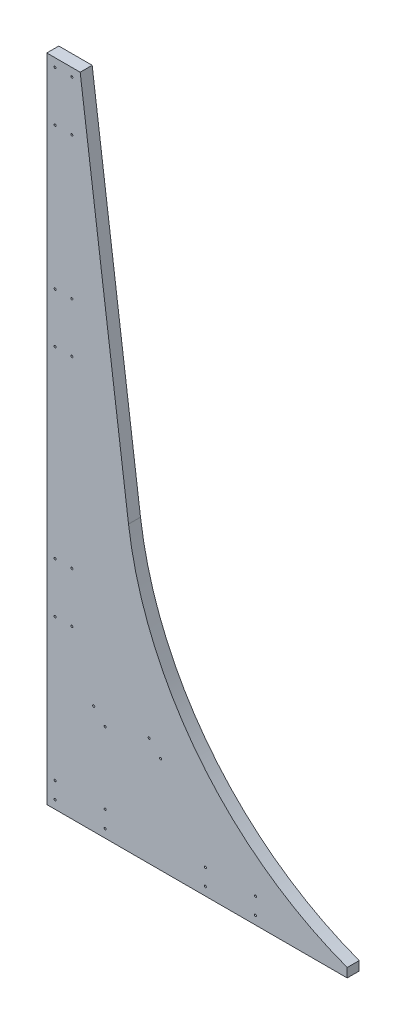
ISO-10303-21;
HEADER;
FILE_DESCRIPTION(('STEP AP214'),'2;1');
FILE_NAME('part.step','',(''),(''),'','','');
FILE_SCHEMA(('AUTOMOTIVE_DESIGN { 1 0 10303 214 1 1 1 1 }'));
ENDSEC;
DATA;
#1=APPLICATION_CONTEXT('core data for automotive mechanical design processes');
#2=APPLICATION_PROTOCOL_DEFINITION('international standard','automotive_design',2000,#1);
#3=PRODUCT_CONTEXT('',#1,'mechanical');
#4=PRODUCT('Part','Part','',(#3));
#5=PRODUCT_RELATED_PRODUCT_CATEGORY('part','',(#4));
#6=PRODUCT_DEFINITION_FORMATION('','',#4);
#7=PRODUCT_DEFINITION_CONTEXT('part definition',#1,'design');
#8=PRODUCT_DEFINITION('design','',#6,#7);
#9=PRODUCT_DEFINITION_SHAPE('','',#8);
#10=(LENGTH_UNIT() NAMED_UNIT(*) SI_UNIT(.MILLI.,.METRE.));
#11=(NAMED_UNIT(*) PLANE_ANGLE_UNIT() SI_UNIT($,.RADIAN.));
#12=(NAMED_UNIT(*) SI_UNIT($,.STERADIAN.) SOLID_ANGLE_UNIT());
#13=UNCERTAINTY_MEASURE_WITH_UNIT(LENGTH_MEASURE(1.E-05),#10,'distance_accuracy_value','');
#14=(GEOMETRIC_REPRESENTATION_CONTEXT(3) GLOBAL_UNCERTAINTY_ASSIGNED_CONTEXT((#13)) GLOBAL_UNIT_ASSIGNED_CONTEXT((#10,
#11,#12)) REPRESENTATION_CONTEXT('',''));
#15=CARTESIAN_POINT('',(0.,0.,0.));
#16=DIRECTION('',(0.,0.,1.));
#17=DIRECTION('',(1.,0.,0.));
#18=AXIS2_PLACEMENT_3D('',#15,#16,#17);
#19=CARTESIAN_POINT('',(638.116559349375,499.436357901165,18.25625));
#20=DIRECTION('',(0.,0.,-1.));
#21=DIRECTION('',(-1.,0.,0.));
#22=AXIS2_PLACEMENT_3D('',#19,#20,#21);
#23=CYLINDRICAL_SURFACE('',#22,518.182264806593);
#24=CARTESIAN_POINT('',(638.116559349375,499.436357901165,0.));
#25=DIRECTION('',(0.,0.,1.));
#26=DIRECTION('',(1.,0.,0.));
#27=AXIS2_PLACEMENT_3D('',#24,#25,#26);
#28=CIRCLE('',#27,518.182264806593);
#29=CARTESIAN_POINT('',(124.367415651835,431.8,0.));
#30=VERTEX_POINT('',#29);
#31=CARTESIAN_POINT('',(457.201,13.8620382080899,0.));
#32=VERTEX_POINT('',#31);
#33=EDGE_CURVE('E133',#30,#32,#28,.T.);
#34=ORIENTED_EDGE('',*,*,#33,.F.);
#35=DIRECTION('',(0.,0.,-1.));
#36=VECTOR('',#35,1.);
#37=CARTESIAN_POINT('',(124.367415651835,431.8,18.25625));
#38=LINE('',#37,#36);
#39=CARTESIAN_POINT('',(124.367415651835,431.8,18.25625));
#40=VERTEX_POINT('',#39);
#41=EDGE_CURVE('E11',#40,#30,#38,.T.);
#42=ORIENTED_EDGE('',*,*,#41,.F.);
#43=CARTESIAN_POINT('',(638.116559349375,499.436357901165,18.25625));
#44=DIRECTION('',(0.,0.,1.));
#45=DIRECTION('',(1.,0.,0.));
#46=AXIS2_PLACEMENT_3D('',#43,#44,#45);
#47=CIRCLE('',#46,518.182264806593);
#48=CARTESIAN_POINT('',(457.201,13.8620382080899,18.25625));
#49=VERTEX_POINT('',#48);
#50=EDGE_CURVE('E154',#40,#49,#47,.T.);
#51=ORIENTED_EDGE('',*,*,#50,.T.);
#52=DIRECTION('',(0.,0.,-1.));
#53=VECTOR('',#52,1.);
#54=CARTESIAN_POINT('',(457.201,13.8620382080899,18.25625));
#55=LINE('',#54,#53);
#56=EDGE_CURVE('E61',#49,#32,#55,.T.);
#57=ORIENTED_EDGE('',*,*,#56,.T.);
#58=EDGE_LOOP('',(#34,#42,#51,#57));
#59=FACE_BOUND('',#58,.T.);
#60=ADVANCED_FACE('F44',(#59),#23,.F.);
#61=CARTESIAN_POINT('',(178.127589027018,23.4509419846275,18.25625));
#62=DIRECTION('',(0.991444861373811,0.130526192220048,0.));
#63=DIRECTION('',(-0.130526192220048,0.991444861373811,0.));
#64=AXIS2_PLACEMENT_3D('',#61,#62,#63);
#65=PLANE('',#64);
#66=DIRECTION('',(0.130526192220048,-0.991444861373811,0.));
#67=VECTOR('',#66,1.);
#68=CARTESIAN_POINT('',(178.127589027018,23.4509419846275,0.));
#69=LINE('',#68,#67);
#70=CARTESIAN_POINT('',(50.8,990.6,0.));
#71=VERTEX_POINT('',#70);
#72=EDGE_CURVE('E136',#71,#30,#69,.T.);
#73=ORIENTED_EDGE('',*,*,#72,.F.);
#74=DIRECTION('',(0.,0.,-1.));
#75=VECTOR('',#74,1.);
#76=CARTESIAN_POINT('',(50.8,990.6,18.25625));
#77=LINE('',#76,#75);
#78=CARTESIAN_POINT('',(50.8,990.6,18.25625));
#79=VERTEX_POINT('',#78);
#80=EDGE_CURVE('E53',#79,#71,#77,.T.);
#81=ORIENTED_EDGE('',*,*,#80,.F.);
#82=DIRECTION('',(0.130526192220048,-0.991444861373811,0.));
#83=VECTOR('',#82,1.);
#84=CARTESIAN_POINT('',(178.127589027018,23.4509419846275,18.25625));
#85=LINE('',#84,#83);
#86=EDGE_CURVE('E127',#79,#40,#85,.T.);
#87=ORIENTED_EDGE('',*,*,#86,.T.);
#88=ORIENTED_EDGE('',*,*,#41,.T.);
#89=EDGE_LOOP('',(#73,#81,#87,#88));
#90=FACE_BOUND('',#89,.T.);
#91=ADVANCED_FACE('F167',(#90),#65,.T.);
#92=CARTESIAN_POINT('',(0.,990.6,18.25625));
#93=DIRECTION('',(0.,1.,0.));
#94=DIRECTION('',(0.,0.,1.));
#95=AXIS2_PLACEMENT_3D('',#92,#93,#94);
#96=PLANE('',#95);
#97=DIRECTION('',(1.,0.,0.));
#98=VECTOR('',#97,1.);
#99=CARTESIAN_POINT('',(0.,990.6,0.));
#100=LINE('',#99,#98);
#101=CARTESIAN_POINT('',(0.,990.6,0.));
#102=VERTEX_POINT('',#101);
#103=EDGE_CURVE('E141',#102,#71,#100,.T.);
#104=ORIENTED_EDGE('',*,*,#103,.F.);
#105=DIRECTION('',(0.,0.,-1.));
#106=VECTOR('',#105,1.);
#107=CARTESIAN_POINT('',(0.,990.6,18.25625));
#108=LINE('',#107,#106);
#109=CARTESIAN_POINT('',(0.,990.6,18.25625));
#110=VERTEX_POINT('',#109);
#111=EDGE_CURVE('E110',#110,#102,#108,.T.);
#112=ORIENTED_EDGE('',*,*,#111,.F.);
#113=DIRECTION('',(1.,0.,0.));
#114=VECTOR('',#113,1.);
#115=CARTESIAN_POINT('',(0.,990.6,18.25625));
#116=LINE('',#115,#114);
#117=EDGE_CURVE('E123',#110,#79,#116,.T.);
#118=ORIENTED_EDGE('',*,*,#117,.T.);
#119=ORIENTED_EDGE('',*,*,#80,.T.);
#120=EDGE_LOOP('',(#104,#112,#118,#119));
#121=FACE_BOUND('',#120,.T.);
#122=ADVANCED_FACE('F164',(#121),#96,.T.);
#123=CARTESIAN_POINT('',(0.,0.,18.25625));
#124=DIRECTION('',(-1.,0.,0.));
#125=DIRECTION('',(0.,0.,1.));
#126=AXIS2_PLACEMENT_3D('',#123,#124,#125);
#127=PLANE('',#126);
#128=DIRECTION('',(0.,1.,0.));
#129=VECTOR('',#128,1.);
#130=CARTESIAN_POINT('',(0.,0.,0.));
#131=LINE('',#130,#129);
#132=CARTESIAN_POINT('',(0.,0.,0.));
#133=VERTEX_POINT('',#132);
#134=EDGE_CURVE('E106',#133,#102,#131,.T.);
#135=ORIENTED_EDGE('',*,*,#134,.F.);
#136=DIRECTION('',(0.,0.,-1.));
#137=VECTOR('',#136,1.);
#138=CARTESIAN_POINT('',(0.,0.,18.25625));
#139=LINE('',#138,#137);
#140=CARTESIAN_POINT('',(0.,0.,18.25625));
#141=VERTEX_POINT('',#140);
#142=EDGE_CURVE('E100',#141,#133,#139,.T.);
#143=ORIENTED_EDGE('',*,*,#142,.F.);
#144=DIRECTION('',(0.,1.,0.));
#145=VECTOR('',#144,1.);
#146=CARTESIAN_POINT('',(0.,0.,18.25625));
#147=LINE('',#146,#145);
#148=EDGE_CURVE('E104',#141,#110,#147,.T.);
#149=ORIENTED_EDGE('',*,*,#148,.T.);
#150=ORIENTED_EDGE('',*,*,#111,.T.);
#151=EDGE_LOOP('',(#135,#143,#149,#150));
#152=FACE_BOUND('',#151,.T.);
#153=ADVANCED_FACE('F102',(#152),#127,.T.);
#154=CARTESIAN_POINT('',(0.,0.,18.25625));
#155=DIRECTION('',(0.,1.,0.));
#156=DIRECTION('',(0.,0.,1.));
#157=AXIS2_PLACEMENT_3D('',#154,#155,#156);
#158=PLANE('',#157);
#159=DIRECTION('',(1.,0.,0.));
#160=VECTOR('',#159,1.);
#161=CARTESIAN_POINT('',(0.,0.,0.));
#162=LINE('',#161,#160);
#163=CARTESIAN_POINT('',(457.201,0.,0.));
#164=VERTEX_POINT('',#163);
#165=EDGE_CURVE('E147',#133,#164,#162,.T.);
#166=ORIENTED_EDGE('',*,*,#165,.T.);
#167=DIRECTION('',(0.,0.,-1.));
#168=VECTOR('',#167,1.);
#169=CARTESIAN_POINT('',(457.201,0.,18.25625));
#170=LINE('',#169,#168);
#171=CARTESIAN_POINT('',(457.201,0.,18.25625));
#172=VERTEX_POINT('',#171);
#173=EDGE_CURVE('E81',#172,#164,#170,.T.);
#174=ORIENTED_EDGE('',*,*,#173,.F.);
#175=DIRECTION('',(1.,0.,0.));
#176=VECTOR('',#175,1.);
#177=CARTESIAN_POINT('',(0.,0.,18.25625));
#178=LINE('',#177,#176);
#179=EDGE_CURVE('E112',#141,#172,#178,.T.);
#180=ORIENTED_EDGE('',*,*,#179,.F.);
#181=ORIENTED_EDGE('',*,*,#142,.T.);
#182=EDGE_LOOP('',(#166,#174,#180,#181));
#183=FACE_BOUND('',#182,.T.);
#184=ADVANCED_FACE('F113',(#183),#158,.F.);
#185=CARTESIAN_POINT('',(457.201,0.,18.25625));
#186=DIRECTION('',(1.,0.,0.));
#187=DIRECTION('',(0.,0.,-1.));
#188=AXIS2_PLACEMENT_3D('',#185,#186,#187);
#189=PLANE('',#188);
#190=DIRECTION('',(0.,-1.,0.));
#191=VECTOR('',#190,1.);
#192=CARTESIAN_POINT('',(457.201,0.,0.));
#193=LINE('',#192,#191);
#194=EDGE_CURVE('E150',#32,#164,#193,.T.);
#195=ORIENTED_EDGE('',*,*,#194,.F.);
#196=ORIENTED_EDGE('',*,*,#56,.F.);
#197=DIRECTION('',(0.,-1.,0.));
#198=VECTOR('',#197,1.);
#199=CARTESIAN_POINT('',(457.201,0.,18.25625));
#200=LINE('',#199,#198);
#201=EDGE_CURVE('E117',#49,#172,#200,.T.);
#202=ORIENTED_EDGE('',*,*,#201,.T.);
#203=ORIENTED_EDGE('',*,*,#173,.T.);
#204=EDGE_LOOP('',(#195,#196,#202,#203));
#205=FACE_BOUND('',#204,.T.);
#206=ADVANCED_FACE('F170',(#205),#189,.T.);
#207=CARTESIAN_POINT('',(0.,0.,18.25625));
#208=DIRECTION('',(0.,0.,1.));
#209=DIRECTION('',(1.,0.,0.));
#210=AXIS2_PLACEMENT_3D('',#207,#208,#209);
#211=PLANE('',#210);
#212=CARTESIAN_POINT('',(173.2788,147.112433493281,18.25625));
#213=DIRECTION('',(0.,0.,1.));
#214=DIRECTION('',(1.,0.,0.));
#215=AXIS2_PLACEMENT_3D('',#212,#213,#214);
#216=CIRCLE('',#215,1.58749999999999);
#217=CARTESIAN_POINT('',(174.8663,147.112433493281,18.25625));
#218=VERTEX_POINT('',#217);
#219=EDGE_CURVE('E467',#218,#218,#216,.T.);
#220=ORIENTED_EDGE('',*,*,#219,.F.);
#221=EDGE_LOOP('',(#220));
#222=FACE_BOUND('',#221,.T.);
#223=CARTESIAN_POINT('',(155.8036,165.527433493281,18.25625));
#224=DIRECTION('',(0.,0.,1.));
#225=DIRECTION('',(1.,0.,0.));
#226=AXIS2_PLACEMENT_3D('',#223,#224,#225);
#227=CIRCLE('',#226,1.58749999999999);
#228=CARTESIAN_POINT('',(157.3911,165.527433493281,18.25625));
#229=VERTEX_POINT('',#228);
#230=EDGE_CURVE('E471',#229,#229,#227,.T.);
#231=ORIENTED_EDGE('',*,*,#230,.F.);
#232=EDGE_LOOP('',(#231));
#233=FACE_BOUND('',#232,.T.);
#234=CARTESIAN_POINT('',(71.4248,165.527433493281,18.25625));
#235=DIRECTION('',(0.,0.,1.));
#236=DIRECTION('',(1.,0.,0.));
#237=AXIS2_PLACEMENT_3D('',#234,#235,#236);
#238=CIRCLE('',#237,1.5875);
#239=CARTESIAN_POINT('',(73.0123,165.527433493281,18.25625));
#240=VERTEX_POINT('',#239);
#241=EDGE_CURVE('E648',#240,#240,#238,.T.);
#242=ORIENTED_EDGE('',*,*,#241,.F.);
#243=EDGE_LOOP('',(#242));
#244=FACE_BOUND('',#243,.T.);
#245=CARTESIAN_POINT('',(88.9,147.112433493281,18.25625));
#246=DIRECTION('',(0.,0.,1.));
#247=DIRECTION('',(1.,0.,0.));
#248=AXIS2_PLACEMENT_3D('',#245,#246,#247);
#249=CIRCLE('',#248,1.5875);
#250=CARTESIAN_POINT('',(90.4875,147.112433493281,18.25625));
#251=VERTEX_POINT('',#250);
#252=EDGE_CURVE('E480',#251,#251,#249,.T.);
#253=ORIENTED_EDGE('',*,*,#252,.F.);
#254=EDGE_LOOP('',(#253));
#255=FACE_BOUND('',#254,.T.);
#256=CARTESIAN_POINT('',(12.7000000000001,38.0999999999999,18.25625));
#257=DIRECTION('',(0.,0.,1.));
#258=DIRECTION('',(1.,0.,0.));
#259=AXIS2_PLACEMENT_3D('',#256,#257,#258);
#260=CIRCLE('',#259,1.5875);
#261=CARTESIAN_POINT('',(14.2875000000001,38.0999999999999,18.25625));
#262=VERTEX_POINT('',#261);
#263=EDGE_CURVE('E529',#262,#262,#260,.T.);
#264=ORIENTED_EDGE('',*,*,#263,.F.);
#265=EDGE_LOOP('',(#264));
#266=FACE_BOUND('',#265,.T.);
#267=CARTESIAN_POINT('',(38.1000000000001,330.2,18.25625));
#268=DIRECTION('',(0.,0.,1.));
#269=DIRECTION('',(1.,0.,0.));
#270=AXIS2_PLACEMENT_3D('',#267,#268,#269);
#271=CIRCLE('',#270,1.58750000000001);
#272=CARTESIAN_POINT('',(39.6875000000001,330.2,18.25625));
#273=VERTEX_POINT('',#272);
#274=EDGE_CURVE('E546',#273,#273,#271,.T.);
#275=ORIENTED_EDGE('',*,*,#274,.F.);
#276=EDGE_LOOP('',(#275));
#277=FACE_BOUND('',#276,.T.);
#278=CARTESIAN_POINT('',(12.7000000000001,330.2,18.25625));
#279=DIRECTION('',(0.,0.,1.));
#280=DIRECTION('',(1.,0.,0.));
#281=AXIS2_PLACEMENT_3D('',#278,#279,#280);
#282=CIRCLE('',#281,1.5875);
#283=CARTESIAN_POINT('',(14.2875000000001,330.2,18.25625));
#284=VERTEX_POINT('',#283);
#285=EDGE_CURVE('E545',#284,#284,#282,.T.);
#286=ORIENTED_EDGE('',*,*,#285,.F.);
#287=EDGE_LOOP('',(#286));
#288=FACE_BOUND('',#287,.T.);
#289=CARTESIAN_POINT('',(38.1000000000001,254.,18.25625));
#290=DIRECTION('',(0.,0.,1.));
#291=DIRECTION('',(1.,0.,0.));
#292=AXIS2_PLACEMENT_3D('',#289,#290,#291);
#293=CIRCLE('',#292,1.58750000000006);
#294=CARTESIAN_POINT('',(39.6875000000001,254.,18.25625));
#295=VERTEX_POINT('',#294);
#296=EDGE_CURVE('E562',#295,#295,#293,.T.);
#297=ORIENTED_EDGE('',*,*,#296,.F.);
#298=EDGE_LOOP('',(#297));
#299=FACE_BOUND('',#298,.T.);
#300=CARTESIAN_POINT('',(241.3,38.0999999999999,18.25625));
#301=DIRECTION('',(0.,0.,1.));
#302=DIRECTION('',(1.,0.,0.));
#303=AXIS2_PLACEMENT_3D('',#300,#301,#302);
#304=CIRCLE('',#303,1.58749999999999);
#305=CARTESIAN_POINT('',(242.8875,38.0999999999999,18.25625));
#306=VERTEX_POINT('',#305);
#307=EDGE_CURVE('E497',#306,#306,#304,.T.);
#308=ORIENTED_EDGE('',*,*,#307,.F.);
#309=EDGE_LOOP('',(#308));
#310=FACE_BOUND('',#309,.T.);
#311=CARTESIAN_POINT('',(88.9000000000001,12.6999999999999,18.25625));
#312=DIRECTION('',(0.,0.,1.));
#313=DIRECTION('',(1.,0.,0.));
#314=AXIS2_PLACEMENT_3D('',#311,#312,#313);
#315=CIRCLE('',#314,1.58749999999998);
#316=CARTESIAN_POINT('',(90.4875000000001,12.6999999999999,18.25625));
#317=VERTEX_POINT('',#316);
#318=EDGE_CURVE('E514',#317,#317,#315,.T.);
#319=ORIENTED_EDGE('',*,*,#318,.F.);
#320=EDGE_LOOP('',(#319));
#321=FACE_BOUND('',#320,.T.);
#322=CARTESIAN_POINT('',(88.9000000000001,38.0999999999999,18.25625));
#323=DIRECTION('',(0.,0.,1.));
#324=DIRECTION('',(1.,0.,0.));
#325=AXIS2_PLACEMENT_3D('',#322,#323,#324);
#326=CIRCLE('',#325,1.58749999999999);
#327=CARTESIAN_POINT('',(90.4875000000001,38.0999999999999,18.25625));
#328=VERTEX_POINT('',#327);
#329=EDGE_CURVE('E513',#328,#328,#326,.T.);
#330=ORIENTED_EDGE('',*,*,#329,.F.);
#331=EDGE_LOOP('',(#330));
#332=FACE_BOUND('',#331,.T.);
#333=CARTESIAN_POINT('',(12.7000000000001,12.6999999999999,18.25625));
#334=DIRECTION('',(0.,0.,1.));
#335=DIRECTION('',(1.,0.,0.));
#336=AXIS2_PLACEMENT_3D('',#333,#334,#335);
#337=CIRCLE('',#336,1.5875);
#338=CARTESIAN_POINT('',(14.2875000000001,12.6999999999999,18.25625));
#339=VERTEX_POINT('',#338);
#340=EDGE_CURVE('E530',#339,#339,#337,.T.);
#341=ORIENTED_EDGE('',*,*,#340,.F.);
#342=EDGE_LOOP('',(#341));
#343=FACE_BOUND('',#342,.T.);
#344=CARTESIAN_POINT('',(12.7,609.6,18.25625));
#345=DIRECTION('',(0.,0.,1.));
#346=DIRECTION('',(1.,0.,0.));
#347=AXIS2_PLACEMENT_3D('',#344,#345,#346);
#348=CIRCLE('',#347,1.58750000000007);
#349=CARTESIAN_POINT('',(14.2875000000001,609.6,18.25625));
#350=VERTEX_POINT('',#349);
#351=EDGE_CURVE('E593',#350,#350,#348,.T.);
#352=ORIENTED_EDGE('',*,*,#351,.F.);
#353=EDGE_LOOP('',(#352));
#354=FACE_BOUND('',#353,.T.);
#355=CARTESIAN_POINT('',(38.1,901.7,18.25625));
#356=DIRECTION('',(0.,0.,1.));
#357=DIRECTION('',(1.,0.,0.));
#358=AXIS2_PLACEMENT_3D('',#355,#356,#357);
#359=CIRCLE('',#358,1.58750000000008);
#360=CARTESIAN_POINT('',(39.6875000000001,901.7,18.25625));
#361=VERTEX_POINT('',#360);
#362=EDGE_CURVE('E610',#361,#361,#359,.T.);
#363=ORIENTED_EDGE('',*,*,#362,.F.);
#364=EDGE_LOOP('',(#363));
#365=FACE_BOUND('',#364,.T.);
#366=CARTESIAN_POINT('',(12.7,901.7,18.25625));
#367=DIRECTION('',(0.,0.,1.));
#368=DIRECTION('',(1.,0.,0.));
#369=AXIS2_PLACEMENT_3D('',#366,#367,#368);
#370=CIRCLE('',#369,1.58750000000007);
#371=CARTESIAN_POINT('',(14.2875000000001,901.7,18.25625));
#372=VERTEX_POINT('',#371);
#373=EDGE_CURVE('E609',#372,#372,#370,.T.);
#374=ORIENTED_EDGE('',*,*,#373,.F.);
#375=EDGE_LOOP('',(#374));
#376=FACE_BOUND('',#375,.T.);
#377=CARTESIAN_POINT('',(38.1,977.9,18.25625));
#378=DIRECTION('',(0.,0.,1.));
#379=DIRECTION('',(1.,0.,0.));
#380=AXIS2_PLACEMENT_3D('',#377,#378,#379);
#381=CIRCLE('',#380,1.58750000000007);
#382=CARTESIAN_POINT('',(39.6875000000001,977.9,18.25625));
#383=VERTEX_POINT('',#382);
#384=EDGE_CURVE('E626',#383,#383,#381,.T.);
#385=ORIENTED_EDGE('',*,*,#384,.F.);
#386=EDGE_LOOP('',(#385));
#387=FACE_BOUND('',#386,.T.);
#388=CARTESIAN_POINT('',(12.7000000000001,254.,18.25625));
#389=DIRECTION('',(0.,0.,1.));
#390=DIRECTION('',(1.,0.,0.));
#391=AXIS2_PLACEMENT_3D('',#388,#389,#390);
#392=CIRCLE('',#391,1.58750000000002);
#393=CARTESIAN_POINT('',(14.2875000000001,254.,18.25625));
#394=VERTEX_POINT('',#393);
#395=EDGE_CURVE('E561',#394,#394,#392,.T.);
#396=ORIENTED_EDGE('',*,*,#395,.F.);
#397=EDGE_LOOP('',(#396));
#398=FACE_BOUND('',#397,.T.);
#399=CARTESIAN_POINT('',(38.1,685.8,18.25625));
#400=DIRECTION('',(0.,0.,1.));
#401=DIRECTION('',(1.,0.,0.));
#402=AXIS2_PLACEMENT_3D('',#399,#400,#401);
#403=CIRCLE('',#402,1.58750000000007);
#404=CARTESIAN_POINT('',(39.6875000000001,685.8,18.25625));
#405=VERTEX_POINT('',#404);
#406=EDGE_CURVE('E578',#405,#405,#403,.T.);
#407=ORIENTED_EDGE('',*,*,#406,.F.);
#408=EDGE_LOOP('',(#407));
#409=FACE_BOUND('',#408,.T.);
#410=CARTESIAN_POINT('',(12.7,685.8,18.25625));
#411=DIRECTION('',(0.,0.,1.));
#412=DIRECTION('',(1.,0.,0.));
#413=AXIS2_PLACEMENT_3D('',#410,#411,#412);
#414=CIRCLE('',#413,1.58750000000004);
#415=CARTESIAN_POINT('',(14.2875000000001,685.8,18.25625));
#416=VERTEX_POINT('',#415);
#417=EDGE_CURVE('E577',#416,#416,#414,.T.);
#418=ORIENTED_EDGE('',*,*,#417,.F.);
#419=EDGE_LOOP('',(#418));
#420=FACE_BOUND('',#419,.T.);
#421=CARTESIAN_POINT('',(38.1000000000001,609.6,18.25625));
#422=DIRECTION('',(0.,0.,1.));
#423=DIRECTION('',(1.,0.,0.));
#424=AXIS2_PLACEMENT_3D('',#421,#422,#423);
#425=CIRCLE('',#424,1.58750000000007);
#426=CARTESIAN_POINT('',(39.6875000000001,609.6,18.25625));
#427=VERTEX_POINT('',#426);
#428=EDGE_CURVE('E594',#427,#427,#425,.T.);
#429=ORIENTED_EDGE('',*,*,#428,.F.);
#430=EDGE_LOOP('',(#429));
#431=FACE_BOUND('',#430,.T.);
#432=CARTESIAN_POINT('',(317.5,12.6999999999999,18.25625));
#433=DIRECTION('',(0.,0.,1.));
#434=DIRECTION('',(1.,0.,0.));
#435=AXIS2_PLACEMENT_3D('',#432,#433,#434);
#436=CIRCLE('',#435,1.58750000000004);
#437=CARTESIAN_POINT('',(319.0875,12.6999999999999,18.25625));
#438=VERTEX_POINT('',#437);
#439=EDGE_CURVE('E479',#438,#438,#436,.T.);
#440=ORIENTED_EDGE('',*,*,#439,.F.);
#441=EDGE_LOOP('',(#440));
#442=FACE_BOUND('',#441,.T.);
#443=CARTESIAN_POINT('',(241.3,12.6999999999999,18.25625));
#444=DIRECTION('',(0.,0.,1.));
#445=DIRECTION('',(1.,0.,0.));
#446=AXIS2_PLACEMENT_3D('',#443,#444,#445);
#447=CIRCLE('',#446,1.58749999999999);
#448=CARTESIAN_POINT('',(242.8875,12.6999999999999,18.25625));
#449=VERTEX_POINT('',#448);
#450=EDGE_CURVE('E489',#449,#449,#447,.T.);
#451=ORIENTED_EDGE('',*,*,#450,.F.);
#452=EDGE_LOOP('',(#451));
#453=FACE_BOUND('',#452,.T.);
#454=CARTESIAN_POINT('',(317.5,38.0999999999999,18.25625));
#455=DIRECTION('',(0.,0.,1.));
#456=DIRECTION('',(1.,0.,0.));
#457=AXIS2_PLACEMENT_3D('',#454,#455,#456);
#458=CIRCLE('',#457,1.58750000000004);
#459=CARTESIAN_POINT('',(319.0875,38.0999999999999,18.25625));
#460=VERTEX_POINT('',#459);
#461=EDGE_CURVE('E498',#460,#460,#458,.T.);
#462=ORIENTED_EDGE('',*,*,#461,.F.);
#463=EDGE_LOOP('',(#462));
#464=FACE_BOUND('',#463,.T.);
#465=CARTESIAN_POINT('',(12.7,977.9,18.25625));
#466=DIRECTION('',(0.,0.,1.));
#467=DIRECTION('',(1.,0.,0.));
#468=AXIS2_PLACEMENT_3D('',#465,#466,#467);
#469=CIRCLE('',#468,1.58750000000004);
#470=CARTESIAN_POINT('',(14.2875,977.9,18.25625));
#471=VERTEX_POINT('',#470);
#472=EDGE_CURVE('E625',#471,#471,#469,.T.);
#473=ORIENTED_EDGE('',*,*,#472,.F.);
#474=EDGE_LOOP('',(#473));
#475=FACE_BOUND('',#474,.T.);
#476=ORIENTED_EDGE('',*,*,#50,.F.);
#477=ORIENTED_EDGE('',*,*,#86,.F.);
#478=ORIENTED_EDGE('',*,*,#117,.F.);
#479=ORIENTED_EDGE('',*,*,#148,.F.);
#480=ORIENTED_EDGE('',*,*,#179,.T.);
#481=ORIENTED_EDGE('',*,*,#201,.F.);
#482=EDGE_LOOP('',(#476,#477,#478,#479,#480,#481));
#483=FACE_BOUND('',#482,.T.);
#484=ADVANCED_FACE('F120',(#222,#233,#244,#255,#266,#277,#288,#299,#310,#321,#332,#343,#354,
#365,#376,#387,#398,#409,#420,#431,#442,#453,#464,#475,#483),#211,.T.);
#485=CARTESIAN_POINT('',(0.,0.,0.));
#486=DIRECTION('',(0.,0.,1.));
#487=DIRECTION('',(1.,0.,0.));
#488=AXIS2_PLACEMENT_3D('',#485,#486,#487);
#489=PLANE('',#488);
#490=CARTESIAN_POINT('',(173.2788,147.112433493281,0.));
#491=DIRECTION('',(0.,0.,1.));
#492=DIRECTION('',(1.,0.,0.));
#493=AXIS2_PLACEMENT_3D('',#490,#491,#492);
#494=CIRCLE('',#493,1.58749999999999);
#495=CARTESIAN_POINT('',(174.8663,147.112433493281,0.));
#496=VERTEX_POINT('',#495);
#497=EDGE_CURVE('E464',#496,#496,#494,.T.);
#498=ORIENTED_EDGE('',*,*,#497,.T.);
#499=EDGE_LOOP('',(#498));
#500=FACE_BOUND('',#499,.T.);
#501=CARTESIAN_POINT('',(155.8036,165.527433493281,0.));
#502=DIRECTION('',(0.,0.,1.));
#503=DIRECTION('',(1.,0.,0.));
#504=AXIS2_PLACEMENT_3D('',#501,#502,#503);
#505=CIRCLE('',#504,1.58749999999999);
#506=CARTESIAN_POINT('',(157.3911,165.527433493281,0.));
#507=VERTEX_POINT('',#506);
#508=EDGE_CURVE('E652',#507,#507,#505,.T.);
#509=ORIENTED_EDGE('',*,*,#508,.T.);
#510=EDGE_LOOP('',(#509));
#511=FACE_BOUND('',#510,.T.);
#512=CARTESIAN_POINT('',(71.4248,165.527433493281,0.));
#513=DIRECTION('',(0.,0.,1.));
#514=DIRECTION('',(1.,0.,0.));
#515=AXIS2_PLACEMENT_3D('',#512,#513,#514);
#516=CIRCLE('',#515,1.5875);
#517=CARTESIAN_POINT('',(73.0123,165.527433493281,0.));
#518=VERTEX_POINT('',#517);
#519=EDGE_CURVE('E484',#518,#518,#516,.T.);
#520=ORIENTED_EDGE('',*,*,#519,.T.);
#521=EDGE_LOOP('',(#520));
#522=FACE_BOUND('',#521,.T.);
#523=CARTESIAN_POINT('',(88.9,147.112433493281,0.));
#524=DIRECTION('',(0.,0.,1.));
#525=DIRECTION('',(1.,0.,0.));
#526=AXIS2_PLACEMENT_3D('',#523,#524,#525);
#527=CIRCLE('',#526,1.5875);
#528=CARTESIAN_POINT('',(90.4875,147.112433493281,0.));
#529=VERTEX_POINT('',#528);
#530=EDGE_CURVE('E475',#529,#529,#527,.T.);
#531=ORIENTED_EDGE('',*,*,#530,.T.);
#532=EDGE_LOOP('',(#531));
#533=FACE_BOUND('',#532,.T.);
#534=CARTESIAN_POINT('',(12.7000000000001,38.0999999999999,0.));
#535=DIRECTION('',(0.,0.,1.));
#536=DIRECTION('',(1.,0.,0.));
#537=AXIS2_PLACEMENT_3D('',#534,#535,#536);
#538=CIRCLE('',#537,1.5875);
#539=CARTESIAN_POINT('',(14.2875000000001,38.0999999999999,0.));
#540=VERTEX_POINT('',#539);
#541=EDGE_CURVE('E550',#540,#540,#538,.T.);
#542=ORIENTED_EDGE('',*,*,#541,.T.);
#543=EDGE_LOOP('',(#542));
#544=FACE_BOUND('',#543,.T.);
#545=CARTESIAN_POINT('',(38.1000000000001,330.2,0.));
#546=DIRECTION('',(0.,0.,1.));
#547=DIRECTION('',(1.,0.,0.));
#548=AXIS2_PLACEMENT_3D('',#545,#546,#547);
#549=CIRCLE('',#548,1.58750000000001);
#550=CARTESIAN_POINT('',(39.6875000000001,330.2,0.));
#551=VERTEX_POINT('',#550);
#552=EDGE_CURVE('E541',#551,#551,#549,.T.);
#553=ORIENTED_EDGE('',*,*,#552,.T.);
#554=EDGE_LOOP('',(#553));
#555=FACE_BOUND('',#554,.T.);
#556=CARTESIAN_POINT('',(12.7000000000001,330.2,0.));
#557=DIRECTION('',(0.,0.,1.));
#558=DIRECTION('',(1.,0.,0.));
#559=AXIS2_PLACEMENT_3D('',#556,#557,#558);
#560=CIRCLE('',#559,1.5875);
#561=CARTESIAN_POINT('',(14.2875000000001,330.2,0.));
#562=VERTEX_POINT('',#561);
#563=EDGE_CURVE('E566',#562,#562,#560,.T.);
#564=ORIENTED_EDGE('',*,*,#563,.T.);
#565=EDGE_LOOP('',(#564));
#566=FACE_BOUND('',#565,.T.);
#567=CARTESIAN_POINT('',(38.1000000000001,254.,0.));
#568=DIRECTION('',(0.,0.,1.));
#569=DIRECTION('',(1.,0.,0.));
#570=AXIS2_PLACEMENT_3D('',#567,#568,#569);
#571=CIRCLE('',#570,1.58750000000006);
#572=CARTESIAN_POINT('',(39.6875000000001,254.,0.));
#573=VERTEX_POINT('',#572);
#574=EDGE_CURVE('E557',#573,#573,#571,.T.);
#575=ORIENTED_EDGE('',*,*,#574,.T.);
#576=EDGE_LOOP('',(#575));
#577=FACE_BOUND('',#576,.T.);
#578=CARTESIAN_POINT('',(241.3,38.0999999999999,0.));
#579=DIRECTION('',(0.,0.,1.));
#580=DIRECTION('',(1.,0.,0.));
#581=AXIS2_PLACEMENT_3D('',#578,#579,#580);
#582=CIRCLE('',#581,1.58749999999999);
#583=CARTESIAN_POINT('',(242.8875,38.0999999999999,0.));
#584=VERTEX_POINT('',#583);
#585=EDGE_CURVE('E518',#584,#584,#582,.T.);
#586=ORIENTED_EDGE('',*,*,#585,.T.);
#587=EDGE_LOOP('',(#586));
#588=FACE_BOUND('',#587,.T.);
#589=CARTESIAN_POINT('',(88.9000000000001,12.6999999999999,0.));
#590=DIRECTION('',(0.,0.,1.));
#591=DIRECTION('',(1.,0.,0.));
#592=AXIS2_PLACEMENT_3D('',#589,#590,#591);
#593=CIRCLE('',#592,1.58749999999998);
#594=CARTESIAN_POINT('',(90.4875000000001,12.6999999999999,0.));
#595=VERTEX_POINT('',#594);
#596=EDGE_CURVE('E509',#595,#595,#593,.T.);
#597=ORIENTED_EDGE('',*,*,#596,.T.);
#598=EDGE_LOOP('',(#597));
#599=FACE_BOUND('',#598,.T.);
#600=CARTESIAN_POINT('',(88.9000000000001,38.0999999999999,0.));
#601=DIRECTION('',(0.,0.,1.));
#602=DIRECTION('',(1.,0.,0.));
#603=AXIS2_PLACEMENT_3D('',#600,#601,#602);
#604=CIRCLE('',#603,1.58749999999999);
#605=CARTESIAN_POINT('',(90.4875000000001,38.0999999999999,0.));
#606=VERTEX_POINT('',#605);
#607=EDGE_CURVE('E534',#606,#606,#604,.T.);
#608=ORIENTED_EDGE('',*,*,#607,.T.);
#609=EDGE_LOOP('',(#608));
#610=FACE_BOUND('',#609,.T.);
#611=CARTESIAN_POINT('',(12.7000000000001,12.6999999999999,0.));
#612=DIRECTION('',(0.,0.,1.));
#613=DIRECTION('',(1.,0.,0.));
#614=AXIS2_PLACEMENT_3D('',#611,#612,#613);
#615=CIRCLE('',#614,1.5875);
#616=CARTESIAN_POINT('',(14.2875000000001,12.6999999999999,0.));
#617=VERTEX_POINT('',#616);
#618=EDGE_CURVE('E525',#617,#617,#615,.T.);
#619=ORIENTED_EDGE('',*,*,#618,.T.);
#620=EDGE_LOOP('',(#619));
#621=FACE_BOUND('',#620,.T.);
#622=CARTESIAN_POINT('',(12.7,609.6,0.));
#623=DIRECTION('',(0.,0.,1.));
#624=DIRECTION('',(1.,0.,0.));
#625=AXIS2_PLACEMENT_3D('',#622,#623,#624);
#626=CIRCLE('',#625,1.58750000000007);
#627=CARTESIAN_POINT('',(14.2875000000001,609.6,0.));
#628=VERTEX_POINT('',#627);
#629=EDGE_CURVE('E614',#628,#628,#626,.T.);
#630=ORIENTED_EDGE('',*,*,#629,.T.);
#631=EDGE_LOOP('',(#630));
#632=FACE_BOUND('',#631,.T.);
#633=CARTESIAN_POINT('',(38.1,901.7,0.));
#634=DIRECTION('',(0.,0.,1.));
#635=DIRECTION('',(1.,0.,0.));
#636=AXIS2_PLACEMENT_3D('',#633,#634,#635);
#637=CIRCLE('',#636,1.58750000000008);
#638=CARTESIAN_POINT('',(39.6875000000001,901.7,0.));
#639=VERTEX_POINT('',#638);
#640=EDGE_CURVE('E605',#639,#639,#637,.T.);
#641=ORIENTED_EDGE('',*,*,#640,.T.);
#642=EDGE_LOOP('',(#641));
#643=FACE_BOUND('',#642,.T.);
#644=CARTESIAN_POINT('',(12.7,901.7,0.));
#645=DIRECTION('',(0.,0.,1.));
#646=DIRECTION('',(1.,0.,0.));
#647=AXIS2_PLACEMENT_3D('',#644,#645,#646);
#648=CIRCLE('',#647,1.58750000000007);
#649=CARTESIAN_POINT('',(14.2875000000001,901.7,0.));
#650=VERTEX_POINT('',#649);
#651=EDGE_CURVE('E630',#650,#650,#648,.T.);
#652=ORIENTED_EDGE('',*,*,#651,.T.);
#653=EDGE_LOOP('',(#652));
#654=FACE_BOUND('',#653,.T.);
#655=CARTESIAN_POINT('',(38.1,977.9,0.));
#656=DIRECTION('',(0.,0.,1.));
#657=DIRECTION('',(1.,0.,0.));
#658=AXIS2_PLACEMENT_3D('',#655,#656,#657);
#659=CIRCLE('',#658,1.58750000000007);
#660=CARTESIAN_POINT('',(39.6875000000001,977.9,0.));
#661=VERTEX_POINT('',#660);
#662=EDGE_CURVE('E621',#661,#661,#659,.T.);
#663=ORIENTED_EDGE('',*,*,#662,.T.);
#664=EDGE_LOOP('',(#663));
#665=FACE_BOUND('',#664,.T.);
#666=CARTESIAN_POINT('',(12.7000000000001,254.,0.));
#667=DIRECTION('',(0.,0.,1.));
#668=DIRECTION('',(1.,0.,0.));
#669=AXIS2_PLACEMENT_3D('',#666,#667,#668);
#670=CIRCLE('',#669,1.58750000000002);
#671=CARTESIAN_POINT('',(14.2875000000001,254.,0.));
#672=VERTEX_POINT('',#671);
#673=EDGE_CURVE('E582',#672,#672,#670,.T.);
#674=ORIENTED_EDGE('',*,*,#673,.T.);
#675=EDGE_LOOP('',(#674));
#676=FACE_BOUND('',#675,.T.);
#677=CARTESIAN_POINT('',(38.1,685.8,0.));
#678=DIRECTION('',(0.,0.,1.));
#679=DIRECTION('',(1.,0.,0.));
#680=AXIS2_PLACEMENT_3D('',#677,#678,#679);
#681=CIRCLE('',#680,1.58750000000007);
#682=CARTESIAN_POINT('',(39.6875000000001,685.8,0.));
#683=VERTEX_POINT('',#682);
#684=EDGE_CURVE('E573',#683,#683,#681,.T.);
#685=ORIENTED_EDGE('',*,*,#684,.T.);
#686=EDGE_LOOP('',(#685));
#687=FACE_BOUND('',#686,.T.);
#688=CARTESIAN_POINT('',(12.7,685.8,0.));
#689=DIRECTION('',(0.,0.,1.));
#690=DIRECTION('',(1.,0.,0.));
#691=AXIS2_PLACEMENT_3D('',#688,#689,#690);
#692=CIRCLE('',#691,1.58750000000004);
#693=CARTESIAN_POINT('',(14.2875000000001,685.8,0.));
#694=VERTEX_POINT('',#693);
#695=EDGE_CURVE('E598',#694,#694,#692,.T.);
#696=ORIENTED_EDGE('',*,*,#695,.T.);
#697=EDGE_LOOP('',(#696));
#698=FACE_BOUND('',#697,.T.);
#699=CARTESIAN_POINT('',(38.1000000000001,609.6,0.));
#700=DIRECTION('',(0.,0.,1.));
#701=DIRECTION('',(1.,0.,0.));
#702=AXIS2_PLACEMENT_3D('',#699,#700,#701);
#703=CIRCLE('',#702,1.58750000000007);
#704=CARTESIAN_POINT('',(39.6875000000001,609.6,0.));
#705=VERTEX_POINT('',#704);
#706=EDGE_CURVE('E589',#705,#705,#703,.T.);
#707=ORIENTED_EDGE('',*,*,#706,.T.);
#708=EDGE_LOOP('',(#707));
#709=FACE_BOUND('',#708,.T.);
#710=CARTESIAN_POINT('',(317.5,12.6999999999999,0.));
#711=DIRECTION('',(0.,0.,1.));
#712=DIRECTION('',(1.,0.,0.));
#713=AXIS2_PLACEMENT_3D('',#710,#711,#712);
#714=CIRCLE('',#713,1.58750000000004);
#715=CARTESIAN_POINT('',(319.0875,12.6999999999999,0.));
#716=VERTEX_POINT('',#715);
#717=EDGE_CURVE('E485',#716,#716,#714,.T.);
#718=ORIENTED_EDGE('',*,*,#717,.T.);
#719=EDGE_LOOP('',(#718));
#720=FACE_BOUND('',#719,.T.);
#721=CARTESIAN_POINT('',(241.3,12.6999999999999,0.));
#722=DIRECTION('',(0.,0.,1.));
#723=DIRECTION('',(1.,0.,0.));
#724=AXIS2_PLACEMENT_3D('',#721,#722,#723);
#725=CIRCLE('',#724,1.58749999999999);
#726=CARTESIAN_POINT('',(242.8875,12.6999999999999,0.));
#727=VERTEX_POINT('',#726);
#728=EDGE_CURVE('E502',#727,#727,#725,.T.);
#729=ORIENTED_EDGE('',*,*,#728,.T.);
#730=EDGE_LOOP('',(#729));
#731=FACE_BOUND('',#730,.T.);
#732=CARTESIAN_POINT('',(317.5,38.0999999999999,0.));
#733=DIRECTION('',(0.,0.,1.));
#734=DIRECTION('',(1.,0.,0.));
#735=AXIS2_PLACEMENT_3D('',#732,#733,#734);
#736=CIRCLE('',#735,1.58750000000004);
#737=CARTESIAN_POINT('',(319.0875,38.0999999999999,0.));
#738=VERTEX_POINT('',#737);
#739=EDGE_CURVE('E493',#738,#738,#736,.T.);
#740=ORIENTED_EDGE('',*,*,#739,.T.);
#741=EDGE_LOOP('',(#740));
#742=FACE_BOUND('',#741,.T.);
#743=CARTESIAN_POINT('',(12.7,977.9,0.));
#744=DIRECTION('',(0.,0.,1.));
#745=DIRECTION('',(1.,0.,0.));
#746=AXIS2_PLACEMENT_3D('',#743,#744,#745);
#747=CIRCLE('',#746,1.58750000000004);
#748=CARTESIAN_POINT('',(14.2875,977.9,0.));
#749=VERTEX_POINT('',#748);
#750=EDGE_CURVE('E137',#749,#749,#747,.T.);
#751=ORIENTED_EDGE('',*,*,#750,.T.);
#752=EDGE_LOOP('',(#751));
#753=FACE_BOUND('',#752,.T.);
#754=ORIENTED_EDGE('',*,*,#33,.T.);
#755=ORIENTED_EDGE('',*,*,#194,.T.);
#756=ORIENTED_EDGE('',*,*,#165,.F.);
#757=ORIENTED_EDGE('',*,*,#134,.T.);
#758=ORIENTED_EDGE('',*,*,#103,.T.);
#759=ORIENTED_EDGE('',*,*,#72,.T.);
#760=EDGE_LOOP('',(#754,#755,#756,#757,#758,#759));
#761=FACE_BOUND('',#760,.T.);
#762=ADVANCED_FACE('F169',(#500,#511,#522,#533,#544,#555,#566,#577,#588,#599,#610,#621,#632,
#643,#654,#665,#676,#687,#698,#709,#720,#731,#742,#753,#761),#489,.F.);
#763=CARTESIAN_POINT('',(12.7,977.9,0.));
#764=DIRECTION('',(0.,0.,1.));
#765=DIRECTION('',(1.,0.,0.));
#766=AXIS2_PLACEMENT_3D('',#763,#764,#765);
#767=CYLINDRICAL_SURFACE('',#766,1.58750000000004);
#768=ORIENTED_EDGE('',*,*,#750,.F.);
#769=EDGE_LOOP('',(#768));
#770=FACE_BOUND('',#769,.T.);
#771=ORIENTED_EDGE('',*,*,#472,.T.);
#772=EDGE_LOOP('',(#771));
#773=FACE_BOUND('',#772,.T.);
#774=ADVANCED_FACE('F209',(#770,#773),#767,.F.);
#775=CARTESIAN_POINT('',(317.5,38.0999999999999,0.));
#776=DIRECTION('',(0.,0.,1.));
#777=DIRECTION('',(1.,0.,0.));
#778=AXIS2_PLACEMENT_3D('',#775,#776,#777);
#779=CYLINDRICAL_SURFACE('',#778,1.58750000000004);
#780=ORIENTED_EDGE('',*,*,#739,.F.);
#781=EDGE_LOOP('',(#780));
#782=FACE_BOUND('',#781,.T.);
#783=ORIENTED_EDGE('',*,*,#461,.T.);
#784=EDGE_LOOP('',(#783));
#785=FACE_BOUND('',#784,.T.);
#786=ADVANCED_FACE('F214',(#782,#785),#779,.F.);
#787=CARTESIAN_POINT('',(241.3,12.6999999999999,0.));
#788=DIRECTION('',(0.,0.,1.));
#789=DIRECTION('',(1.,0.,0.));
#790=AXIS2_PLACEMENT_3D('',#787,#788,#789);
#791=CYLINDRICAL_SURFACE('',#790,1.58749999999999);
#792=ORIENTED_EDGE('',*,*,#728,.F.);
#793=EDGE_LOOP('',(#792));
#794=FACE_BOUND('',#793,.T.);
#795=ORIENTED_EDGE('',*,*,#450,.T.);
#796=EDGE_LOOP('',(#795));
#797=FACE_BOUND('',#796,.T.);
#798=ADVANCED_FACE('F226',(#794,#797),#791,.F.);
#799=CARTESIAN_POINT('',(317.5,12.6999999999999,0.));
#800=DIRECTION('',(0.,0.,1.));
#801=DIRECTION('',(1.,0.,0.));
#802=AXIS2_PLACEMENT_3D('',#799,#800,#801);
#803=CYLINDRICAL_SURFACE('',#802,1.58750000000004);
#804=ORIENTED_EDGE('',*,*,#717,.F.);
#805=EDGE_LOOP('',(#804));
#806=FACE_BOUND('',#805,.T.);
#807=ORIENTED_EDGE('',*,*,#439,.T.);
#808=EDGE_LOOP('',(#807));
#809=FACE_BOUND('',#808,.T.);
#810=ADVANCED_FACE('F236',(#806,#809),#803,.F.);
#811=CARTESIAN_POINT('',(38.1000000000001,609.6,0.));
#812=DIRECTION('',(0.,0.,1.));
#813=DIRECTION('',(1.,0.,0.));
#814=AXIS2_PLACEMENT_3D('',#811,#812,#813);
#815=CYLINDRICAL_SURFACE('',#814,1.58750000000007);
#816=ORIENTED_EDGE('',*,*,#706,.F.);
#817=EDGE_LOOP('',(#816));
#818=FACE_BOUND('',#817,.T.);
#819=ORIENTED_EDGE('',*,*,#428,.T.);
#820=EDGE_LOOP('',(#819));
#821=FACE_BOUND('',#820,.T.);
#822=ADVANCED_FACE('F246',(#818,#821),#815,.F.);
#823=CARTESIAN_POINT('',(12.7,685.8,0.));
#824=DIRECTION('',(0.,0.,1.));
#825=DIRECTION('',(1.,0.,0.));
#826=AXIS2_PLACEMENT_3D('',#823,#824,#825);
#827=CYLINDRICAL_SURFACE('',#826,1.58750000000004);
#828=ORIENTED_EDGE('',*,*,#695,.F.);
#829=EDGE_LOOP('',(#828));
#830=FACE_BOUND('',#829,.T.);
#831=ORIENTED_EDGE('',*,*,#417,.T.);
#832=EDGE_LOOP('',(#831));
#833=FACE_BOUND('',#832,.T.);
#834=ADVANCED_FACE('F256',(#830,#833),#827,.F.);
#835=CARTESIAN_POINT('',(38.1,685.8,0.));
#836=DIRECTION('',(0.,0.,1.));
#837=DIRECTION('',(1.,0.,0.));
#838=AXIS2_PLACEMENT_3D('',#835,#836,#837);
#839=CYLINDRICAL_SURFACE('',#838,1.58750000000007);
#840=ORIENTED_EDGE('',*,*,#684,.F.);
#841=EDGE_LOOP('',(#840));
#842=FACE_BOUND('',#841,.T.);
#843=ORIENTED_EDGE('',*,*,#406,.T.);
#844=EDGE_LOOP('',(#843));
#845=FACE_BOUND('',#844,.T.);
#846=ADVANCED_FACE('F266',(#842,#845),#839,.F.);
#847=CARTESIAN_POINT('',(12.7000000000001,254.,0.));
#848=DIRECTION('',(0.,0.,1.));
#849=DIRECTION('',(1.,0.,0.));
#850=AXIS2_PLACEMENT_3D('',#847,#848,#849);
#851=CYLINDRICAL_SURFACE('',#850,1.58750000000002);
#852=ORIENTED_EDGE('',*,*,#673,.F.);
#853=EDGE_LOOP('',(#852));
#854=FACE_BOUND('',#853,.T.);
#855=ORIENTED_EDGE('',*,*,#395,.T.);
#856=EDGE_LOOP('',(#855));
#857=FACE_BOUND('',#856,.T.);
#858=ADVANCED_FACE('F276',(#854,#857),#851,.F.);
#859=CARTESIAN_POINT('',(38.1,977.9,0.));
#860=DIRECTION('',(0.,0.,1.));
#861=DIRECTION('',(1.,0.,0.));
#862=AXIS2_PLACEMENT_3D('',#859,#860,#861);
#863=CYLINDRICAL_SURFACE('',#862,1.58750000000007);
#864=ORIENTED_EDGE('',*,*,#662,.F.);
#865=EDGE_LOOP('',(#864));
#866=FACE_BOUND('',#865,.T.);
#867=ORIENTED_EDGE('',*,*,#384,.T.);
#868=EDGE_LOOP('',(#867));
#869=FACE_BOUND('',#868,.T.);
#870=ADVANCED_FACE('F286',(#866,#869),#863,.F.);
#871=CARTESIAN_POINT('',(12.7,901.7,0.));
#872=DIRECTION('',(0.,0.,1.));
#873=DIRECTION('',(1.,0.,0.));
#874=AXIS2_PLACEMENT_3D('',#871,#872,#873);
#875=CYLINDRICAL_SURFACE('',#874,1.58750000000007);
#876=ORIENTED_EDGE('',*,*,#651,.F.);
#877=EDGE_LOOP('',(#876));
#878=FACE_BOUND('',#877,.T.);
#879=ORIENTED_EDGE('',*,*,#373,.T.);
#880=EDGE_LOOP('',(#879));
#881=FACE_BOUND('',#880,.T.);
#882=ADVANCED_FACE('F296',(#878,#881),#875,.F.);
#883=CARTESIAN_POINT('',(38.1,901.7,0.));
#884=DIRECTION('',(0.,0.,1.));
#885=DIRECTION('',(1.,0.,0.));
#886=AXIS2_PLACEMENT_3D('',#883,#884,#885);
#887=CYLINDRICAL_SURFACE('',#886,1.58750000000008);
#888=ORIENTED_EDGE('',*,*,#640,.F.);
#889=EDGE_LOOP('',(#888));
#890=FACE_BOUND('',#889,.T.);
#891=ORIENTED_EDGE('',*,*,#362,.T.);
#892=EDGE_LOOP('',(#891));
#893=FACE_BOUND('',#892,.T.);
#894=ADVANCED_FACE('F306',(#890,#893),#887,.F.);
#895=CARTESIAN_POINT('',(12.7,609.6,0.));
#896=DIRECTION('',(0.,0.,1.));
#897=DIRECTION('',(1.,0.,0.));
#898=AXIS2_PLACEMENT_3D('',#895,#896,#897);
#899=CYLINDRICAL_SURFACE('',#898,1.58750000000007);
#900=ORIENTED_EDGE('',*,*,#629,.F.);
#901=EDGE_LOOP('',(#900));
#902=FACE_BOUND('',#901,.T.);
#903=ORIENTED_EDGE('',*,*,#351,.T.);
#904=EDGE_LOOP('',(#903));
#905=FACE_BOUND('',#904,.T.);
#906=ADVANCED_FACE('F316',(#902,#905),#899,.F.);
#907=CARTESIAN_POINT('',(12.7000000000001,12.6999999999999,0.));
#908=DIRECTION('',(0.,0.,1.));
#909=DIRECTION('',(1.,0.,0.));
#910=AXIS2_PLACEMENT_3D('',#907,#908,#909);
#911=CYLINDRICAL_SURFACE('',#910,1.5875);
#912=ORIENTED_EDGE('',*,*,#618,.F.);
#913=EDGE_LOOP('',(#912));
#914=FACE_BOUND('',#913,.T.);
#915=ORIENTED_EDGE('',*,*,#340,.T.);
#916=EDGE_LOOP('',(#915));
#917=FACE_BOUND('',#916,.T.);
#918=ADVANCED_FACE('F326',(#914,#917),#911,.F.);
#919=CARTESIAN_POINT('',(88.9000000000001,38.0999999999999,0.));
#920=DIRECTION('',(0.,0.,1.));
#921=DIRECTION('',(1.,0.,0.));
#922=AXIS2_PLACEMENT_3D('',#919,#920,#921);
#923=CYLINDRICAL_SURFACE('',#922,1.58749999999999);
#924=ORIENTED_EDGE('',*,*,#607,.F.);
#925=EDGE_LOOP('',(#924));
#926=FACE_BOUND('',#925,.T.);
#927=ORIENTED_EDGE('',*,*,#329,.T.);
#928=EDGE_LOOP('',(#927));
#929=FACE_BOUND('',#928,.T.);
#930=ADVANCED_FACE('F336',(#926,#929),#923,.F.);
#931=CARTESIAN_POINT('',(88.9000000000001,12.6999999999999,0.));
#932=DIRECTION('',(0.,0.,1.));
#933=DIRECTION('',(1.,0.,0.));
#934=AXIS2_PLACEMENT_3D('',#931,#932,#933);
#935=CYLINDRICAL_SURFACE('',#934,1.58749999999998);
#936=ORIENTED_EDGE('',*,*,#596,.F.);
#937=EDGE_LOOP('',(#936));
#938=FACE_BOUND('',#937,.T.);
#939=ORIENTED_EDGE('',*,*,#318,.T.);
#940=EDGE_LOOP('',(#939));
#941=FACE_BOUND('',#940,.T.);
#942=ADVANCED_FACE('F346',(#938,#941),#935,.F.);
#943=CARTESIAN_POINT('',(241.3,38.0999999999999,0.));
#944=DIRECTION('',(0.,0.,1.));
#945=DIRECTION('',(1.,0.,0.));
#946=AXIS2_PLACEMENT_3D('',#943,#944,#945);
#947=CYLINDRICAL_SURFACE('',#946,1.58749999999999);
#948=ORIENTED_EDGE('',*,*,#585,.F.);
#949=EDGE_LOOP('',(#948));
#950=FACE_BOUND('',#949,.T.);
#951=ORIENTED_EDGE('',*,*,#307,.T.);
#952=EDGE_LOOP('',(#951));
#953=FACE_BOUND('',#952,.T.);
#954=ADVANCED_FACE('F356',(#950,#953),#947,.F.);
#955=CARTESIAN_POINT('',(38.1000000000001,254.,0.));
#956=DIRECTION('',(0.,0.,1.));
#957=DIRECTION('',(1.,0.,0.));
#958=AXIS2_PLACEMENT_3D('',#955,#956,#957);
#959=CYLINDRICAL_SURFACE('',#958,1.58750000000006);
#960=ORIENTED_EDGE('',*,*,#574,.F.);
#961=EDGE_LOOP('',(#960));
#962=FACE_BOUND('',#961,.T.);
#963=ORIENTED_EDGE('',*,*,#296,.T.);
#964=EDGE_LOOP('',(#963));
#965=FACE_BOUND('',#964,.T.);
#966=ADVANCED_FACE('F366',(#962,#965),#959,.F.);
#967=CARTESIAN_POINT('',(12.7000000000001,330.2,0.));
#968=DIRECTION('',(0.,0.,1.));
#969=DIRECTION('',(1.,0.,0.));
#970=AXIS2_PLACEMENT_3D('',#967,#968,#969);
#971=CYLINDRICAL_SURFACE('',#970,1.5875);
#972=ORIENTED_EDGE('',*,*,#563,.F.);
#973=EDGE_LOOP('',(#972));
#974=FACE_BOUND('',#973,.T.);
#975=ORIENTED_EDGE('',*,*,#285,.T.);
#976=EDGE_LOOP('',(#975));
#977=FACE_BOUND('',#976,.T.);
#978=ADVANCED_FACE('F376',(#974,#977),#971,.F.);
#979=CARTESIAN_POINT('',(38.1000000000001,330.2,0.));
#980=DIRECTION('',(0.,0.,1.));
#981=DIRECTION('',(1.,0.,0.));
#982=AXIS2_PLACEMENT_3D('',#979,#980,#981);
#983=CYLINDRICAL_SURFACE('',#982,1.58750000000001);
#984=ORIENTED_EDGE('',*,*,#552,.F.);
#985=EDGE_LOOP('',(#984));
#986=FACE_BOUND('',#985,.T.);
#987=ORIENTED_EDGE('',*,*,#274,.T.);
#988=EDGE_LOOP('',(#987));
#989=FACE_BOUND('',#988,.T.);
#990=ADVANCED_FACE('F386',(#986,#989),#983,.F.);
#991=CARTESIAN_POINT('',(12.7000000000001,38.0999999999999,0.));
#992=DIRECTION('',(0.,0.,1.));
#993=DIRECTION('',(1.,0.,0.));
#994=AXIS2_PLACEMENT_3D('',#991,#992,#993);
#995=CYLINDRICAL_SURFACE('',#994,1.5875);
#996=ORIENTED_EDGE('',*,*,#541,.F.);
#997=EDGE_LOOP('',(#996));
#998=FACE_BOUND('',#997,.T.);
#999=ORIENTED_EDGE('',*,*,#263,.T.);
#1000=EDGE_LOOP('',(#999));
#1001=FACE_BOUND('',#1000,.T.);
#1002=ADVANCED_FACE('F396',(#998,#1001),#995,.F.);
#1003=CARTESIAN_POINT('',(88.9,147.112433493281,0.));
#1004=DIRECTION('',(0.,0.,1.));
#1005=DIRECTION('',(1.,0.,0.));
#1006=AXIS2_PLACEMENT_3D('',#1003,#1004,#1005);
#1007=CYLINDRICAL_SURFACE('',#1006,1.5875);
#1008=ORIENTED_EDGE('',*,*,#530,.F.);
#1009=EDGE_LOOP('',(#1008));
#1010=FACE_BOUND('',#1009,.T.);
#1011=ORIENTED_EDGE('',*,*,#252,.T.);
#1012=EDGE_LOOP('',(#1011));
#1013=FACE_BOUND('',#1012,.T.);
#1014=ADVANCED_FACE('F406',(#1010,#1013),#1007,.F.);
#1015=CARTESIAN_POINT('',(71.4248,165.527433493281,0.));
#1016=DIRECTION('',(0.,0.,1.));
#1017=DIRECTION('',(1.,0.,0.));
#1018=AXIS2_PLACEMENT_3D('',#1015,#1016,#1017);
#1019=CYLINDRICAL_SURFACE('',#1018,1.5875);
#1020=ORIENTED_EDGE('',*,*,#519,.F.);
#1021=EDGE_LOOP('',(#1020));
#1022=FACE_BOUND('',#1021,.T.);
#1023=ORIENTED_EDGE('',*,*,#241,.T.);
#1024=EDGE_LOOP('',(#1023));
#1025=FACE_BOUND('',#1024,.T.);
#1026=ADVANCED_FACE('F427',(#1022,#1025),#1019,.F.);
#1027=CARTESIAN_POINT('',(155.8036,165.527433493281,0.));
#1028=DIRECTION('',(0.,0.,1.));
#1029=DIRECTION('',(1.,0.,0.));
#1030=AXIS2_PLACEMENT_3D('',#1027,#1028,#1029);
#1031=CYLINDRICAL_SURFACE('',#1030,1.58749999999999);
#1032=ORIENTED_EDGE('',*,*,#508,.F.);
#1033=EDGE_LOOP('',(#1032));
#1034=FACE_BOUND('',#1033,.T.);
#1035=ORIENTED_EDGE('',*,*,#230,.T.);
#1036=EDGE_LOOP('',(#1035));
#1037=FACE_BOUND('',#1036,.T.);
#1038=ADVANCED_FACE('F437',(#1034,#1037),#1031,.F.);
#1039=CARTESIAN_POINT('',(173.2788,147.112433493281,0.));
#1040=DIRECTION('',(0.,0.,1.));
#1041=DIRECTION('',(1.,0.,0.));
#1042=AXIS2_PLACEMENT_3D('',#1039,#1040,#1041);
#1043=CYLINDRICAL_SURFACE('',#1042,1.58749999999999);
#1044=ORIENTED_EDGE('',*,*,#497,.F.);
#1045=EDGE_LOOP('',(#1044));
#1046=FACE_BOUND('',#1045,.T.);
#1047=ORIENTED_EDGE('',*,*,#219,.T.);
#1048=EDGE_LOOP('',(#1047));
#1049=FACE_BOUND('',#1048,.T.);
#1050=ADVANCED_FACE('F447',(#1046,#1049),#1043,.F.);
#1051=CLOSED_SHELL('',(#60,#91,#122,#153,#184,#206,#484,#762,#774,#786,#798,#810,#822,#834,#846,
#858,#870,#882,#894,#906,#918,#930,#942,#954,#966,#978,#990,#1002,#1014,#1026,#1038,#1050));
#1052=MANIFOLD_SOLID_BREP('B2',#1051);
#1053=ADVANCED_BREP_SHAPE_REPRESENTATION('',(#18,#1052),#14);
#1054=SHAPE_DEFINITION_REPRESENTATION(#9,#1053);
ENDSEC;
END-ISO-10303-21;
